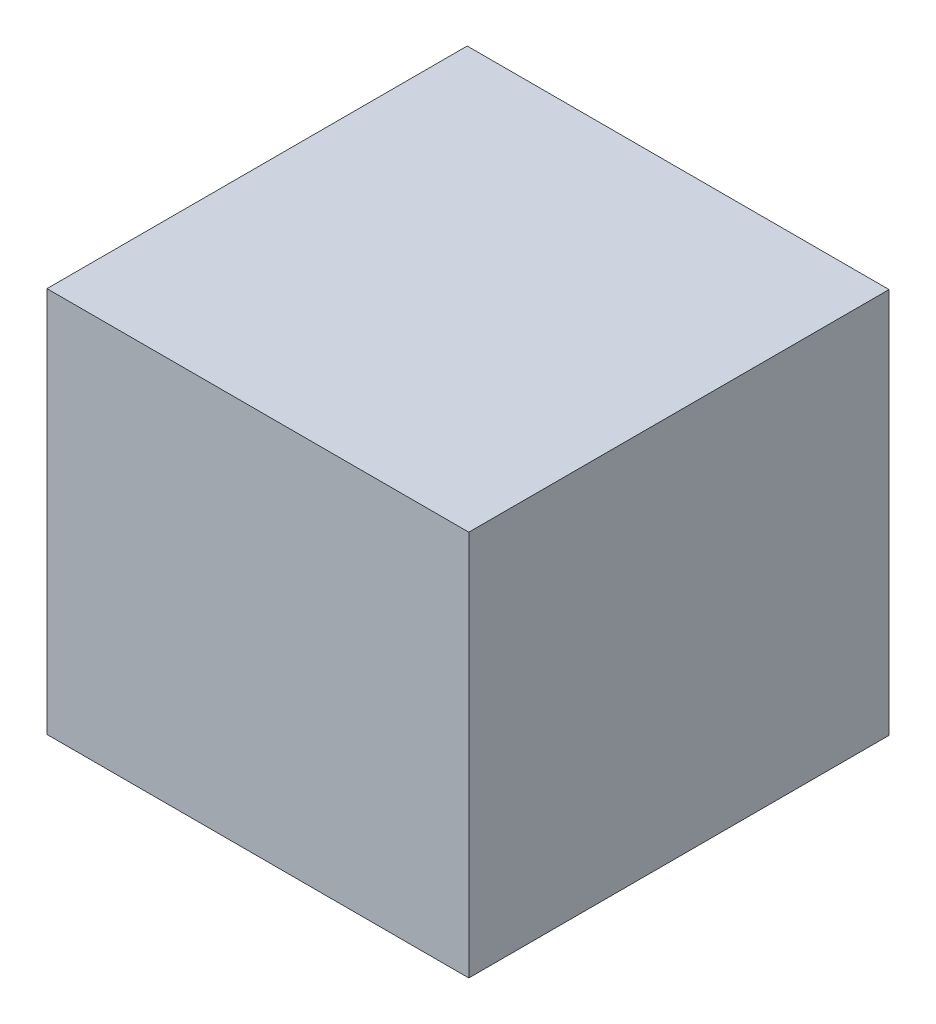
ISO-10303-21;
HEADER;
FILE_DESCRIPTION(('STEP AP214'),'2;1');
FILE_NAME('part.step','',(''),(''),'','','');
FILE_SCHEMA(('AUTOMOTIVE_DESIGN { 1 0 10303 214 1 1 1 1 }'));
ENDSEC;
DATA;
#1=APPLICATION_CONTEXT('core data for automotive mechanical design processes');
#2=APPLICATION_PROTOCOL_DEFINITION('international standard','automotive_design',2000,#1);
#3=PRODUCT_CONTEXT('',#1,'mechanical');
#4=PRODUCT('Part','Part','',(#3));
#5=PRODUCT_RELATED_PRODUCT_CATEGORY('part','',(#4));
#6=PRODUCT_DEFINITION_FORMATION('','',#4);
#7=PRODUCT_DEFINITION_CONTEXT('part definition',#1,'design');
#8=PRODUCT_DEFINITION('design','',#6,#7);
#9=PRODUCT_DEFINITION_SHAPE('','',#8);
#10=(LENGTH_UNIT() NAMED_UNIT(*) SI_UNIT(.MILLI.,.METRE.));
#11=(NAMED_UNIT(*) PLANE_ANGLE_UNIT() SI_UNIT($,.RADIAN.));
#12=(NAMED_UNIT(*) SI_UNIT($,.STERADIAN.) SOLID_ANGLE_UNIT());
#13=UNCERTAINTY_MEASURE_WITH_UNIT(LENGTH_MEASURE(1.E-05),#10,'distance_accuracy_value','');
#14=(GEOMETRIC_REPRESENTATION_CONTEXT(3) GLOBAL_UNCERTAINTY_ASSIGNED_CONTEXT((#13)) GLOBAL_UNIT_ASSIGNED_CONTEXT((#10,
#11,#12)) REPRESENTATION_CONTEXT('',''));
#15=CARTESIAN_POINT('',(0.,0.,0.));
#16=DIRECTION('',(0.,0.,1.));
#17=DIRECTION('',(1.,0.,0.));
#18=AXIS2_PLACEMENT_3D('',#15,#16,#17);
#19=CARTESIAN_POINT('',(-2.221625861511,0.579987042339182,0.));
#20=DIRECTION('',(1.,0.,0.));
#21=DIRECTION('',(0.,1.,0.));
#22=AXIS2_PLACEMENT_3D('',#19,#20,#21);
#23=PLANE('',#22);
#24=DIRECTION('',(0.,-1.,0.));
#25=VECTOR('',#24,1.);
#26=CARTESIAN_POINT('',(-2.221625861511,0.671862314884077,0.));
#27=LINE('',#26,#25);
#28=CARTESIAN_POINT('',(-2.221625861511,0.671862314884077,0.));
#29=VERTEX_POINT('',#28);
#30=CARTESIAN_POINT('',(-2.221625861511,0.579987042339182,0.));
#31=VERTEX_POINT('',#30);
#32=EDGE_CURVE('E11',#29,#31,#27,.T.);
#33=ORIENTED_EDGE('',*,*,#32,.F.);
#34=DIRECTION('',(0.,0.,1.));
#35=VECTOR('',#34,1.);
#36=CARTESIAN_POINT('',(-2.221625861511,0.671862314884077,0.));
#37=LINE('',#36,#35);
#38=CARTESIAN_POINT('',(-2.221625861511,0.671862314884077,0.1));
#39=VERTEX_POINT('',#38);
#40=EDGE_CURVE('E24',#29,#39,#37,.T.);
#41=ORIENTED_EDGE('',*,*,#40,.T.);
#42=DIRECTION('',(0.,1.,0.));
#43=VECTOR('',#42,1.);
#44=CARTESIAN_POINT('',(-2.221625861511,0.671862314884077,0.1));
#45=LINE('',#44,#43);
#46=CARTESIAN_POINT('',(-2.221625861511,0.579987042339182,0.1));
#47=VERTEX_POINT('',#46);
#48=EDGE_CURVE('E75',#47,#39,#45,.T.);
#49=ORIENTED_EDGE('',*,*,#48,.F.);
#50=DIRECTION('',(0.,0.,1.));
#51=VECTOR('',#50,1.);
#52=CARTESIAN_POINT('',(-2.221625861511,0.579987042339182,0.));
#53=LINE('',#52,#51);
#54=EDGE_CURVE('E85',#31,#47,#53,.T.);
#55=ORIENTED_EDGE('',*,*,#54,.F.);
#56=EDGE_LOOP('',(#33,#41,#49,#55));
#57=FACE_BOUND('',#56,.T.);
#58=ADVANCED_FACE('F17',(#57),#23,.T.);
#59=CARTESIAN_POINT('',(-2.322008103736,0.579987042339182,0.));
#60=DIRECTION('',(0.,-1.,0.));
#61=DIRECTION('',(1.,0.,0.));
#62=AXIS2_PLACEMENT_3D('',#59,#60,#61);
#63=PLANE('',#62);
#64=DIRECTION('',(-1.,0.,0.));
#65=VECTOR('',#64,1.);
#66=CARTESIAN_POINT('',(-2.221625861511,0.579987042339182,0.));
#67=LINE('',#66,#65);
#68=CARTESIAN_POINT('',(-2.322008103736,0.579987042339182,0.));
#69=VERTEX_POINT('',#68);
#70=EDGE_CURVE('E83',#31,#69,#67,.T.);
#71=ORIENTED_EDGE('',*,*,#70,.F.);
#72=ORIENTED_EDGE('',*,*,#54,.T.);
#73=DIRECTION('',(1.,0.,0.));
#74=VECTOR('',#73,1.);
#75=CARTESIAN_POINT('',(-2.221625861511,0.579987042339182,0.1));
#76=LINE('',#75,#74);
#77=CARTESIAN_POINT('',(-2.322008103736,0.579987042339182,0.1));
#78=VERTEX_POINT('',#77);
#79=EDGE_CURVE('E81',#78,#47,#76,.T.);
#80=ORIENTED_EDGE('',*,*,#79,.F.);
#81=DIRECTION('',(0.,0.,1.));
#82=VECTOR('',#81,1.);
#83=CARTESIAN_POINT('',(-2.322008103736,0.579987042339182,0.));
#84=LINE('',#83,#82);
#85=EDGE_CURVE('E61',#69,#78,#84,.T.);
#86=ORIENTED_EDGE('',*,*,#85,.F.);
#87=EDGE_LOOP('',(#71,#72,#80,#86));
#88=FACE_BOUND('',#87,.T.);
#89=ADVANCED_FACE('F91',(#88),#63,.T.);
#90=CARTESIAN_POINT('',(-2.322008103736,0.671862314884077,0.));
#91=DIRECTION('',(-1.,0.,0.));
#92=DIRECTION('',(0.,-1.,0.));
#93=AXIS2_PLACEMENT_3D('',#90,#91,#92);
#94=PLANE('',#93);
#95=DIRECTION('',(0.,1.,0.));
#96=VECTOR('',#95,1.);
#97=CARTESIAN_POINT('',(-2.322008103736,0.579987042339182,0.));
#98=LINE('',#97,#96);
#99=CARTESIAN_POINT('',(-2.322008103736,0.671862314884077,0.));
#100=VERTEX_POINT('',#99);
#101=EDGE_CURVE('E65',#69,#100,#98,.T.);
#102=ORIENTED_EDGE('',*,*,#101,.F.);
#103=ORIENTED_EDGE('',*,*,#85,.T.);
#104=DIRECTION('',(0.,-1.,0.));
#105=VECTOR('',#104,1.);
#106=CARTESIAN_POINT('',(-2.322008103736,0.579987042339182,0.1));
#107=LINE('',#106,#105);
#108=CARTESIAN_POINT('',(-2.322008103736,0.671862314884077,0.1));
#109=VERTEX_POINT('',#108);
#110=EDGE_CURVE('E54',#109,#78,#107,.T.);
#111=ORIENTED_EDGE('',*,*,#110,.F.);
#112=DIRECTION('',(0.,0.,1.));
#113=VECTOR('',#112,1.);
#114=CARTESIAN_POINT('',(-2.322008103736,0.671862314884077,0.));
#115=LINE('',#114,#113);
#116=EDGE_CURVE('E58',#100,#109,#115,.T.);
#117=ORIENTED_EDGE('',*,*,#116,.F.);
#118=EDGE_LOOP('',(#102,#103,#111,#117));
#119=FACE_BOUND('',#118,.T.);
#120=ADVANCED_FACE('F57',(#119),#94,.T.);
#121=CARTESIAN_POINT('',(-2.221625861511,0.671862314884077,0.));
#122=DIRECTION('',(0.,1.,0.));
#123=DIRECTION('',(-1.,0.,0.));
#124=AXIS2_PLACEMENT_3D('',#121,#122,#123);
#125=PLANE('',#124);
#126=DIRECTION('',(1.,0.,0.));
#127=VECTOR('',#126,1.);
#128=CARTESIAN_POINT('',(-2.322008103736,0.671862314884077,0.));
#129=LINE('',#128,#127);
#130=EDGE_CURVE('E71',#100,#29,#129,.T.);
#131=ORIENTED_EDGE('',*,*,#130,.F.);
#132=ORIENTED_EDGE('',*,*,#116,.T.);
#133=DIRECTION('',(-1.,0.,0.));
#134=VECTOR('',#133,1.);
#135=CARTESIAN_POINT('',(-2.322008103736,0.671862314884077,0.1));
#136=LINE('',#135,#134);
#137=EDGE_CURVE('E70',#39,#109,#136,.T.);
#138=ORIENTED_EDGE('',*,*,#137,.F.);
#139=ORIENTED_EDGE('',*,*,#40,.F.);
#140=EDGE_LOOP('',(#131,#132,#138,#139));
#141=FACE_BOUND('',#140,.T.);
#142=ADVANCED_FACE('F69',(#141),#125,.T.);
#143=CARTESIAN_POINT('',(-2.271816982623,0.62592467861163,0.));
#144=DIRECTION('',(0.,0.,1.));
#145=DIRECTION('',(1.,0.,0.));
#146=AXIS2_PLACEMENT_3D('',#143,#144,#145);
#147=PLANE('',#146);
#148=ORIENTED_EDGE('',*,*,#130,.T.);
#149=ORIENTED_EDGE('',*,*,#32,.T.);
#150=ORIENTED_EDGE('',*,*,#70,.T.);
#151=ORIENTED_EDGE('',*,*,#101,.T.);
#152=EDGE_LOOP('',(#148,#149,#150,#151));
#153=FACE_BOUND('',#152,.T.);
#154=ADVANCED_FACE('F88',(#153),#147,.F.);
#155=CARTESIAN_POINT('',(-2.271816982623,0.62592467861163,0.1));
#156=DIRECTION('',(0.,0.,1.));
#157=DIRECTION('',(1.,0.,0.));
#158=AXIS2_PLACEMENT_3D('',#155,#156,#157);
#159=PLANE('',#158);
#160=ORIENTED_EDGE('',*,*,#137,.T.);
#161=ORIENTED_EDGE('',*,*,#110,.T.);
#162=ORIENTED_EDGE('',*,*,#79,.T.);
#163=ORIENTED_EDGE('',*,*,#48,.T.);
#164=EDGE_LOOP('',(#160,#161,#162,#163));
#165=FACE_BOUND('',#164,.T.);
#166=ADVANCED_FACE('F74',(#165),#159,.T.);
#167=CLOSED_SHELL('',(#58,#89,#120,#142,#154,#166));
#168=MANIFOLD_SOLID_BREP('B1',#167);
#169=ADVANCED_BREP_SHAPE_REPRESENTATION('',(#18,#168),#14);
#170=SHAPE_DEFINITION_REPRESENTATION(#9,#169);
ENDSEC;
END-ISO-10303-21;
